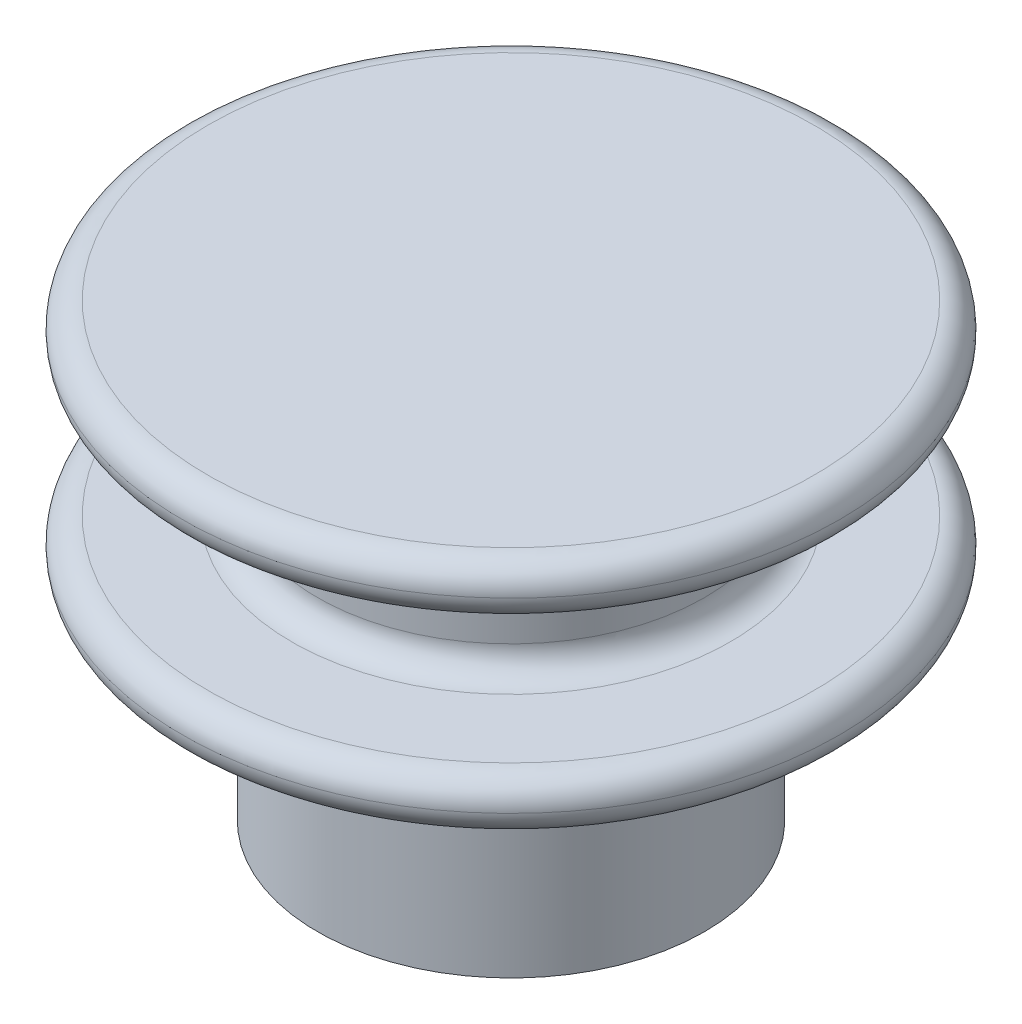
ISO-10303-21;
HEADER;
FILE_DESCRIPTION(('STEP AP214'),'2;1');
FILE_NAME('part.step','',(''),(''),'','','');
FILE_SCHEMA(('AUTOMOTIVE_DESIGN { 1 0 10303 214 1 1 1 1 }'));
ENDSEC;
DATA;
#1=APPLICATION_CONTEXT('core data for automotive mechanical design processes');
#2=APPLICATION_PROTOCOL_DEFINITION('international standard','automotive_design',2000,#1);
#3=PRODUCT_CONTEXT('',#1,'mechanical');
#4=PRODUCT('Part','Part','',(#3));
#5=PRODUCT_RELATED_PRODUCT_CATEGORY('part','',(#4));
#6=PRODUCT_DEFINITION_FORMATION('','',#4);
#7=PRODUCT_DEFINITION_CONTEXT('part definition',#1,'design');
#8=PRODUCT_DEFINITION('design','',#6,#7);
#9=PRODUCT_DEFINITION_SHAPE('','',#8);
#10=(LENGTH_UNIT() NAMED_UNIT(*) SI_UNIT(.MILLI.,.METRE.));
#11=(NAMED_UNIT(*) PLANE_ANGLE_UNIT() SI_UNIT($,.RADIAN.));
#12=(NAMED_UNIT(*) SI_UNIT($,.STERADIAN.) SOLID_ANGLE_UNIT());
#13=UNCERTAINTY_MEASURE_WITH_UNIT(LENGTH_MEASURE(1.E-05),#10,'distance_accuracy_value','');
#14=(GEOMETRIC_REPRESENTATION_CONTEXT(3) GLOBAL_UNCERTAINTY_ASSIGNED_CONTEXT((#13)) GLOBAL_UNIT_ASSIGNED_CONTEXT((#10,
#11,#12)) REPRESENTATION_CONTEXT('',''));
#15=CARTESIAN_POINT('',(0.,0.,0.));
#16=DIRECTION('',(0.,0.,1.));
#17=DIRECTION('',(1.,0.,0.));
#18=AXIS2_PLACEMENT_3D('',#15,#16,#17);
#19=CARTESIAN_POINT('',(10.191,2.0955,0.));
#20=DIRECTION('',(0.,-1.,0.));
#21=DIRECTION('',(1.,0.,0.));
#22=AXIS2_PLACEMENT_3D('',#19,#20,#21);
#23=PLANE('',#22);
#24=CARTESIAN_POINT('',(0.,2.0955,0.));
#25=DIRECTION('',(0.,-1.,0.));
#26=DIRECTION('',(1.,0.,0.));
#27=AXIS2_PLACEMENT_3D('',#24,#25,#26);
#28=CIRCLE('',#27,9.39725);
#29=CARTESIAN_POINT('',(9.39725,2.0955,0.));
#30=VERTEX_POINT('',#29);
#31=EDGE_CURVE('E71',#30,#30,#28,.T.);
#32=ORIENTED_EDGE('',*,*,#31,.T.);
#33=EDGE_LOOP('',(#32));
#34=FACE_BOUND('',#33,.T.);
#35=CARTESIAN_POINT('',(0.,2.0955,0.));
#36=DIRECTION('',(0.,-1.,0.));
#37=DIRECTION('',(1.,0.,0.));
#38=AXIS2_PLACEMENT_3D('',#35,#36,#37);
#39=CIRCLE('',#38,6.79375);
#40=CARTESIAN_POINT('',(6.79375,2.0955,0.));
#41=VERTEX_POINT('',#40);
#42=EDGE_CURVE('E68',#41,#41,#39,.F.);
#43=ORIENTED_EDGE('',*,*,#42,.T.);
#44=EDGE_LOOP('',(#43));
#45=FACE_BOUND('',#44,.T.);
#46=ADVANCED_FACE('F33',(#34,#45),#23,.T.);
#47=CARTESIAN_POINT('',(0.,-3.683,0.));
#48=DIRECTION('',(0.,-1.,0.));
#49=DIRECTION('',(1.,0.,0.));
#50=AXIS2_PLACEMENT_3D('',#47,#48,#49);
#51=CYLINDRICAL_SURFACE('',#50,6.);
#52=CARTESIAN_POINT('',(0.,-1.30175,0.));
#53=DIRECTION('',(0.,1.,0.));
#54=DIRECTION('',(-1.,0.,0.));
#55=AXIS2_PLACEMENT_3D('',#52,#53,#54);
#56=CIRCLE('',#55,6.);
#57=CARTESIAN_POINT('',(-6.,-1.30175,0.));
#58=VERTEX_POINT('',#57);
#59=EDGE_CURVE('E41',#58,#58,#56,.T.);
#60=ORIENTED_EDGE('',*,*,#59,.T.);
#61=EDGE_LOOP('',(#60));
#62=FACE_BOUND('',#61,.T.);
#63=CARTESIAN_POINT('',(0.,1.30175,0.));
#64=DIRECTION('',(0.,-1.,0.));
#65=DIRECTION('',(1.,0.,0.));
#66=AXIS2_PLACEMENT_3D('',#63,#64,#65);
#67=CIRCLE('',#66,6.);
#68=CARTESIAN_POINT('',(6.,1.30175,0.));
#69=VERTEX_POINT('',#68);
#70=EDGE_CURVE('E46',#69,#69,#67,.T.);
#71=ORIENTED_EDGE('',*,*,#70,.T.);
#72=EDGE_LOOP('',(#71));
#73=FACE_BOUND('',#72,.T.);
#74=ADVANCED_FACE('F123',(#62,#73),#51,.T.);
#75=CARTESIAN_POINT('',(6.,-2.0955,0.));
#76=DIRECTION('',(0.,1.,0.));
#77=DIRECTION('',(-1.,0.,0.));
#78=AXIS2_PLACEMENT_3D('',#75,#76,#77);
#79=PLANE('',#78);
#80=CARTESIAN_POINT('',(0.,-2.0955,0.));
#81=DIRECTION('',(0.,1.,0.));
#82=DIRECTION('',(-1.,0.,0.));
#83=AXIS2_PLACEMENT_3D('',#80,#81,#82);
#84=CIRCLE('',#83,9.39725);
#85=CARTESIAN_POINT('',(-9.39725,-2.0955,0.));
#86=VERTEX_POINT('',#85);
#87=EDGE_CURVE('E77',#86,#86,#84,.T.);
#88=ORIENTED_EDGE('',*,*,#87,.T.);
#89=EDGE_LOOP('',(#88));
#90=FACE_BOUND('',#89,.T.);
#91=CARTESIAN_POINT('',(0.,-2.0955,0.));
#92=DIRECTION('',(0.,1.,0.));
#93=DIRECTION('',(-1.,0.,0.));
#94=AXIS2_PLACEMENT_3D('',#91,#92,#93);
#95=CIRCLE('',#94,6.79375);
#96=CARTESIAN_POINT('',(-6.79375,-2.0955,0.));
#97=VERTEX_POINT('',#96);
#98=EDGE_CURVE('E74',#97,#97,#95,.F.);
#99=ORIENTED_EDGE('',*,*,#98,.T.);
#100=EDGE_LOOP('',(#99));
#101=FACE_BOUND('',#100,.T.);
#102=ADVANCED_FACE('F129',(#90,#101),#79,.T.);
#103=CARTESIAN_POINT('',(10.191,-3.683,0.));
#104=DIRECTION('',(0.,-1.,0.));
#105=DIRECTION('',(1.,0.,0.));
#106=AXIS2_PLACEMENT_3D('',#103,#104,#105);
#107=PLANE('',#106);
#108=CARTESIAN_POINT('',(0.,-3.683,0.));
#109=DIRECTION('',(0.,-1.,0.));
#110=DIRECTION('',(1.,0.,0.));
#111=AXIS2_PLACEMENT_3D('',#108,#109,#110);
#112=CIRCLE('',#111,7.29375);
#113=CARTESIAN_POINT('',(7.29375,-3.683,0.));
#114=VERTEX_POINT('',#113);
#115=EDGE_CURVE('E62',#114,#114,#112,.F.);
#116=ORIENTED_EDGE('',*,*,#115,.T.);
#117=EDGE_LOOP('',(#116));
#118=FACE_BOUND('',#117,.T.);
#119=CARTESIAN_POINT('',(0.,-3.683,0.));
#120=DIRECTION('',(0.,-1.,0.));
#121=DIRECTION('',(1.,0.,0.));
#122=AXIS2_PLACEMENT_3D('',#119,#120,#121);
#123=CIRCLE('',#122,9.39725);
#124=CARTESIAN_POINT('',(9.39725,-3.683,0.));
#125=VERTEX_POINT('',#124);
#126=EDGE_CURVE('E59',#125,#125,#123,.T.);
#127=ORIENTED_EDGE('',*,*,#126,.T.);
#128=EDGE_LOOP('',(#127));
#129=FACE_BOUND('',#128,.T.);
#130=ADVANCED_FACE('F166',(#118,#129),#107,.T.);
#131=CARTESIAN_POINT('',(0.,3.683,0.));
#132=DIRECTION('',(0.,1.,0.));
#133=DIRECTION('',(-1.,0.,0.));
#134=AXIS2_PLACEMENT_3D('',#131,#132,#133);
#135=PLANE('',#134);
#136=CARTESIAN_POINT('',(0.,3.683,0.));
#137=DIRECTION('',(0.,1.,0.));
#138=DIRECTION('',(-1.,0.,0.));
#139=AXIS2_PLACEMENT_3D('',#136,#137,#138);
#140=CIRCLE('',#139,9.39725);
#141=CARTESIAN_POINT('',(-9.39725,3.683,0.));
#142=VERTEX_POINT('',#141);
#143=EDGE_CURVE('E65',#142,#142,#140,.T.);
#144=ORIENTED_EDGE('',*,*,#143,.T.);
#145=EDGE_LOOP('',(#144));
#146=FACE_BOUND('',#145,.T.);
#147=ADVANCED_FACE('F171',(#146),#135,.T.);
#148=CARTESIAN_POINT('',(0.,-5.2705,0.));
#149=DIRECTION('',(0.,1.,0.));
#150=DIRECTION('',(-1.,0.,0.));
#151=AXIS2_PLACEMENT_3D('',#148,#149,#150);
#152=CYLINDRICAL_SURFACE('',#151,6.5);
#153=CARTESIAN_POINT('',(0.,-4.47675,0.));
#154=DIRECTION('',(0.,-1.,0.));
#155=DIRECTION('',(1.,0.,0.));
#156=AXIS2_PLACEMENT_3D('',#153,#154,#155);
#157=CIRCLE('',#156,6.5);
#158=CARTESIAN_POINT('',(6.5,-4.47675,0.));
#159=VERTEX_POINT('',#158);
#160=EDGE_CURVE('E55',#159,#159,#157,.T.);
#161=ORIENTED_EDGE('',*,*,#160,.T.);
#162=EDGE_LOOP('',(#161));
#163=FACE_BOUND('',#162,.T.);
#164=CARTESIAN_POINT('',(0.,-5.2705,0.));
#165=DIRECTION('',(0.,-1.,0.));
#166=DIRECTION('',(1.,0.,0.));
#167=AXIS2_PLACEMENT_3D('',#164,#165,#166);
#168=CIRCLE('',#167,6.5);
#169=CARTESIAN_POINT('',(6.5,-5.2705,0.));
#170=VERTEX_POINT('',#169);
#171=EDGE_CURVE('E52',#170,#170,#168,.T.);
#172=ORIENTED_EDGE('',*,*,#171,.F.);
#173=EDGE_LOOP('',(#172));
#174=FACE_BOUND('',#173,.T.);
#175=ADVANCED_FACE('F177',(#163,#174),#152,.T.);
#176=CARTESIAN_POINT('',(0.,-5.2705,0.));
#177=DIRECTION('',(0.,-1.,0.));
#178=DIRECTION('',(1.,0.,0.));
#179=AXIS2_PLACEMENT_3D('',#176,#177,#178);
#180=PLANE('',#179);
#181=CARTESIAN_POINT('',(0.,-5.2705,0.));
#182=DIRECTION('',(0.,-1.,0.));
#183=DIRECTION('',(1.,0.,0.));
#184=AXIS2_PLACEMENT_3D('',#181,#182,#183);
#185=CIRCLE('',#184,6.);
#186=CARTESIAN_POINT('',(6.,-5.2705,0.));
#187=VERTEX_POINT('',#186);
#188=EDGE_CURVE('E10',#187,#187,#185,.T.);
#189=ORIENTED_EDGE('',*,*,#188,.F.);
#190=EDGE_LOOP('',(#189));
#191=FACE_BOUND('',#190,.T.);
#192=ORIENTED_EDGE('',*,*,#171,.T.);
#193=EDGE_LOOP('',(#192));
#194=FACE_BOUND('',#193,.T.);
#195=ADVANCED_FACE('F139',(#191,#194),#180,.T.);
#196=CARTESIAN_POINT('',(0.,-4.47675,0.));
#197=DIRECTION('',(0.,-1.,0.));
#198=DIRECTION('',(1.,0.,0.));
#199=AXIS2_PLACEMENT_3D('',#196,#197,#198);
#200=TOROIDAL_SURFACE('',#199,7.29375,0.79375);
#201=ORIENTED_EDGE('',*,*,#115,.F.);
#202=EDGE_LOOP('',(#201));
#203=FACE_BOUND('',#202,.T.);
#204=ORIENTED_EDGE('',*,*,#160,.F.);
#205=EDGE_LOOP('',(#204));
#206=FACE_BOUND('',#205,.T.);
#207=ADVANCED_FACE('F135',(#203,#206),#200,.F.);
#208=CARTESIAN_POINT('',(0.,2.88925,0.));
#209=DIRECTION('',(0.,-1.,0.));
#210=DIRECTION('',(1.,0.,0.));
#211=AXIS2_PLACEMENT_3D('',#208,#209,#210);
#212=TOROIDAL_SURFACE('',#211,9.39725,0.79375);
#213=ORIENTED_EDGE('',*,*,#31,.F.);
#214=EDGE_LOOP('',(#213));
#215=FACE_BOUND('',#214,.T.);
#216=CARTESIAN_POINT('',(0.,2.88925,0.));
#217=DIRECTION('',(0.,-1.,0.));
#218=DIRECTION('',(1.,0.,0.));
#219=AXIS2_PLACEMENT_3D('',#216,#217,#218);
#220=CIRCLE('',#219,10.191);
#221=CARTESIAN_POINT('',(10.191,2.88925,0.));
#222=VERTEX_POINT('',#221);
#223=EDGE_CURVE('E56',#222,#222,#220,.F.);
#224=ORIENTED_EDGE('',*,*,#223,.F.);
#225=EDGE_LOOP('',(#224));
#226=FACE_BOUND('',#225,.T.);
#227=ADVANCED_FACE('F138',(#215,#226),#212,.T.);
#228=CARTESIAN_POINT('',(0.,2.88925,0.));
#229=DIRECTION('',(0.,1.,0.));
#230=DIRECTION('',(-1.,0.,0.));
#231=AXIS2_PLACEMENT_3D('',#228,#229,#230);
#232=TOROIDAL_SURFACE('',#231,9.39725,0.79375);
#233=ORIENTED_EDGE('',*,*,#143,.F.);
#234=EDGE_LOOP('',(#233));
#235=FACE_BOUND('',#234,.T.);
#236=ORIENTED_EDGE('',*,*,#223,.T.);
#237=EDGE_LOOP('',(#236));
#238=FACE_BOUND('',#237,.T.);
#239=ADVANCED_FACE('F141',(#235,#238),#232,.T.);
#240=CARTESIAN_POINT('',(0.,-2.88925,0.));
#241=DIRECTION('',(0.,1.,0.));
#242=DIRECTION('',(-1.,0.,0.));
#243=AXIS2_PLACEMENT_3D('',#240,#241,#242);
#244=TOROIDAL_SURFACE('',#243,9.39725,0.79375);
#245=ORIENTED_EDGE('',*,*,#87,.F.);
#246=EDGE_LOOP('',(#245));
#247=FACE_BOUND('',#246,.T.);
#248=CARTESIAN_POINT('',(0.,-2.88925,0.));
#249=DIRECTION('',(0.,1.,0.));
#250=DIRECTION('',(-1.,0.,0.));
#251=AXIS2_PLACEMENT_3D('',#248,#249,#250);
#252=CIRCLE('',#251,10.191);
#253=CARTESIAN_POINT('',(-10.191,-2.88925,0.));
#254=VERTEX_POINT('',#253);
#255=EDGE_CURVE('E37',#254,#254,#252,.F.);
#256=ORIENTED_EDGE('',*,*,#255,.F.);
#257=EDGE_LOOP('',(#256));
#258=FACE_BOUND('',#257,.T.);
#259=ADVANCED_FACE('F144',(#247,#258),#244,.T.);
#260=CARTESIAN_POINT('',(0.,-2.88925,0.));
#261=DIRECTION('',(0.,-1.,0.));
#262=DIRECTION('',(1.,0.,0.));
#263=AXIS2_PLACEMENT_3D('',#260,#261,#262);
#264=TOROIDAL_SURFACE('',#263,9.39725,0.79375);
#265=ORIENTED_EDGE('',*,*,#255,.T.);
#266=EDGE_LOOP('',(#265));
#267=FACE_BOUND('',#266,.T.);
#268=ORIENTED_EDGE('',*,*,#126,.F.);
#269=EDGE_LOOP('',(#268));
#270=FACE_BOUND('',#269,.T.);
#271=ADVANCED_FACE('F149',(#267,#270),#264,.T.);
#272=CARTESIAN_POINT('',(0.,-1.30175,0.));
#273=DIRECTION('',(0.,1.,0.));
#274=DIRECTION('',(-1.,0.,0.));
#275=AXIS2_PLACEMENT_3D('',#272,#273,#274);
#276=TOROIDAL_SURFACE('',#275,6.79375,0.79375);
#277=ORIENTED_EDGE('',*,*,#59,.F.);
#278=EDGE_LOOP('',(#277));
#279=FACE_BOUND('',#278,.T.);
#280=ORIENTED_EDGE('',*,*,#98,.F.);
#281=EDGE_LOOP('',(#280));
#282=FACE_BOUND('',#281,.T.);
#283=ADVANCED_FACE('F152',(#279,#282),#276,.F.);
#284=CARTESIAN_POINT('',(0.,1.30175,0.));
#285=DIRECTION('',(0.,-1.,0.));
#286=DIRECTION('',(1.,0.,0.));
#287=AXIS2_PLACEMENT_3D('',#284,#285,#286);
#288=TOROIDAL_SURFACE('',#287,6.79375,0.79375);
#289=ORIENTED_EDGE('',*,*,#42,.F.);
#290=EDGE_LOOP('',(#289));
#291=FACE_BOUND('',#290,.T.);
#292=ORIENTED_EDGE('',*,*,#70,.F.);
#293=EDGE_LOOP('',(#292));
#294=FACE_BOUND('',#293,.T.);
#295=ADVANCED_FACE('F35',(#291,#294),#288,.F.);
#296=CARTESIAN_POINT('',(0.,-10.2705,0.));
#297=DIRECTION('',(0.,1.,0.));
#298=DIRECTION('',(-1.,0.,0.));
#299=AXIS2_PLACEMENT_3D('',#296,#297,#298);
#300=CYLINDRICAL_SURFACE('',#299,6.);
#301=CARTESIAN_POINT('',(0.,-10.2705,0.));
#302=DIRECTION('',(0.,-1.,0.));
#303=DIRECTION('',(1.,0.,0.));
#304=AXIS2_PLACEMENT_3D('',#301,#302,#303);
#305=CIRCLE('',#304,6.);
#306=CARTESIAN_POINT('',(6.,-10.2705,0.));
#307=VERTEX_POINT('',#306);
#308=EDGE_CURVE('E50',#307,#307,#305,.T.);
#309=ORIENTED_EDGE('',*,*,#308,.F.);
#310=EDGE_LOOP('',(#309));
#311=FACE_BOUND('',#310,.T.);
#312=ORIENTED_EDGE('',*,*,#188,.T.);
#313=EDGE_LOOP('',(#312));
#314=FACE_BOUND('',#313,.T.);
#315=ADVANCED_FACE('F109',(#311,#314),#300,.T.);
#316=CARTESIAN_POINT('',(0.,-10.2705,0.));
#317=DIRECTION('',(0.,-1.,0.));
#318=DIRECTION('',(1.,0.,0.));
#319=AXIS2_PLACEMENT_3D('',#316,#317,#318);
#320=PLANE('',#319);
#321=CARTESIAN_POINT('',(-1.7145,-10.2705,0.));
#322=DIRECTION('',(0.,-1.,0.));
#323=DIRECTION('',(1.,0.,0.));
#324=AXIS2_PLACEMENT_3D('',#321,#322,#323);
#325=CIRCLE('',#324,1.651);
#326=CARTESIAN_POINT('',(-0.0634999999999982,-10.2705,0.));
#327=VERTEX_POINT('',#326);
#328=EDGE_CURVE('E92',#327,#327,#325,.T.);
#329=ORIENTED_EDGE('',*,*,#328,.F.);
#330=EDGE_LOOP('',(#329));
#331=FACE_BOUND('',#330,.T.);
#332=CARTESIAN_POINT('',(1.7145,-10.2705,0.));
#333=DIRECTION('',(0.,-1.,0.));
#334=DIRECTION('',(1.,0.,0.));
#335=AXIS2_PLACEMENT_3D('',#332,#333,#334);
#336=CIRCLE('',#335,1.651);
#337=CARTESIAN_POINT('',(3.3655,-10.2705,0.));
#338=VERTEX_POINT('',#337);
#339=EDGE_CURVE('E101',#338,#338,#336,.T.);
#340=ORIENTED_EDGE('',*,*,#339,.F.);
#341=EDGE_LOOP('',(#340));
#342=FACE_BOUND('',#341,.T.);
#343=ORIENTED_EDGE('',*,*,#308,.T.);
#344=EDGE_LOOP('',(#343));
#345=FACE_BOUND('',#344,.T.);
#346=ADVANCED_FACE('F107',(#331,#342,#345),#320,.T.);
#347=CARTESIAN_POINT('',(1.7145,-1.3805,0.));
#348=DIRECTION('',(0.,-1.,0.));
#349=DIRECTION('',(1.,0.,0.));
#350=AXIS2_PLACEMENT_3D('',#347,#348,#349);
#351=CYLINDRICAL_SURFACE('',#350,1.651);
#352=CARTESIAN_POINT('',(1.7145,-1.3805,0.));
#353=DIRECTION('',(0.,-1.,0.));
#354=DIRECTION('',(1.,0.,0.));
#355=AXIS2_PLACEMENT_3D('',#352,#353,#354);
#356=CIRCLE('',#355,1.651);
#357=CARTESIAN_POINT('',(3.3655,-1.3805,0.));
#358=VERTEX_POINT('',#357);
#359=EDGE_CURVE('E97',#358,#358,#356,.T.);
#360=ORIENTED_EDGE('',*,*,#359,.F.);
#361=EDGE_LOOP('',(#360));
#362=FACE_BOUND('',#361,.T.);
#363=ORIENTED_EDGE('',*,*,#339,.T.);
#364=EDGE_LOOP('',(#363));
#365=FACE_BOUND('',#364,.T.);
#366=ADVANCED_FACE('F105',(#362,#365),#351,.F.);
#367=CARTESIAN_POINT('',(1.7145,-1.3805,0.));
#368=DIRECTION('',(0.,-1.,0.));
#369=DIRECTION('',(1.,0.,0.));
#370=AXIS2_PLACEMENT_3D('',#367,#368,#369);
#371=PLANE('',#370);
#372=ORIENTED_EDGE('',*,*,#359,.T.);
#373=EDGE_LOOP('',(#372));
#374=FACE_BOUND('',#373,.T.);
#375=ADVANCED_FACE('F116',(#374),#371,.T.);
#376=CARTESIAN_POINT('',(-1.7145,-1.3805,0.));
#377=DIRECTION('',(0.,-1.,0.));
#378=DIRECTION('',(1.,0.,0.));
#379=AXIS2_PLACEMENT_3D('',#376,#377,#378);
#380=CYLINDRICAL_SURFACE('',#379,1.651);
#381=CARTESIAN_POINT('',(-1.7145,-1.3805,0.));
#382=DIRECTION('',(0.,-1.,0.));
#383=DIRECTION('',(1.,0.,0.));
#384=AXIS2_PLACEMENT_3D('',#381,#382,#383);
#385=CIRCLE('',#384,1.651);
#386=CARTESIAN_POINT('',(-0.0635,-1.3805,0.));
#387=VERTEX_POINT('',#386);
#388=EDGE_CURVE('E88',#387,#387,#385,.T.);
#389=ORIENTED_EDGE('',*,*,#388,.F.);
#390=EDGE_LOOP('',(#389));
#391=FACE_BOUND('',#390,.T.);
#392=ORIENTED_EDGE('',*,*,#328,.T.);
#393=EDGE_LOOP('',(#392));
#394=FACE_BOUND('',#393,.T.);
#395=ADVANCED_FACE('F246',(#391,#394),#380,.F.);
#396=CARTESIAN_POINT('',(-1.7145,-1.3805,0.));
#397=DIRECTION('',(0.,-1.,0.));
#398=DIRECTION('',(1.,0.,0.));
#399=AXIS2_PLACEMENT_3D('',#396,#397,#398);
#400=PLANE('',#399);
#401=ORIENTED_EDGE('',*,*,#388,.T.);
#402=EDGE_LOOP('',(#401));
#403=FACE_BOUND('',#402,.T.);
#404=ADVANCED_FACE('F256',(#403),#400,.T.);
#405=CLOSED_SHELL('',(#46,#74,#102,#130,#147,#175,#195,#207,#227,#239,#259,#271,#283,#295,#315,
#346,#366,#375,#395,#404));
#406=MANIFOLD_SOLID_BREP('B2',#405);
#407=ADVANCED_BREP_SHAPE_REPRESENTATION('',(#18,#406),#14);
#408=SHAPE_DEFINITION_REPRESENTATION(#9,#407);
ENDSEC;
END-ISO-10303-21;
